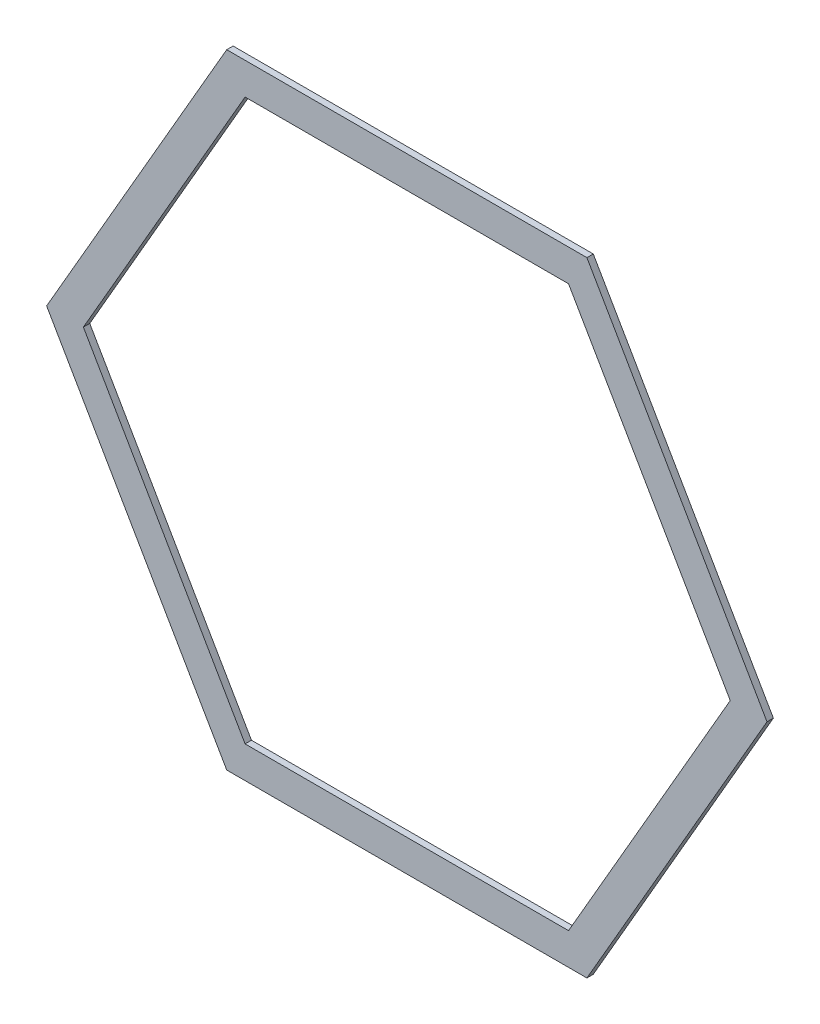
ISO-10303-21;
HEADER;
FILE_DESCRIPTION(('STEP AP214'),'2;1');
FILE_NAME('part.step','',(''),(''),'','','');
FILE_SCHEMA(('AUTOMOTIVE_DESIGN { 1 0 10303 214 1 1 1 1 }'));
ENDSEC;
DATA;
#1=APPLICATION_CONTEXT('core data for automotive mechanical design processes');
#2=APPLICATION_PROTOCOL_DEFINITION('international standard','automotive_design',2000,#1);
#3=PRODUCT_CONTEXT('',#1,'mechanical');
#4=PRODUCT('Part','Part','',(#3));
#5=PRODUCT_RELATED_PRODUCT_CATEGORY('part','',(#4));
#6=PRODUCT_DEFINITION_FORMATION('','',#4);
#7=PRODUCT_DEFINITION_CONTEXT('part definition',#1,'design');
#8=PRODUCT_DEFINITION('design','',#6,#7);
#9=PRODUCT_DEFINITION_SHAPE('','',#8);
#10=(LENGTH_UNIT() NAMED_UNIT(*) SI_UNIT(.MILLI.,.METRE.));
#11=(NAMED_UNIT(*) PLANE_ANGLE_UNIT() SI_UNIT($,.RADIAN.));
#12=(NAMED_UNIT(*) SI_UNIT($,.STERADIAN.) SOLID_ANGLE_UNIT());
#13=UNCERTAINTY_MEASURE_WITH_UNIT(LENGTH_MEASURE(1.E-05),#10,'distance_accuracy_value','');
#14=(GEOMETRIC_REPRESENTATION_CONTEXT(3) GLOBAL_UNCERTAINTY_ASSIGNED_CONTEXT((#13)) GLOBAL_UNIT_ASSIGNED_CONTEXT((#10,
#11,#12)) REPRESENTATION_CONTEXT('',''));
#15=CARTESIAN_POINT('',(0.,0.,0.));
#16=DIRECTION('',(0.,0.,1.));
#17=DIRECTION('',(1.,0.,0.));
#18=AXIS2_PLACEMENT_3D('',#15,#16,#17);
#19=CARTESIAN_POINT('',(0.,0.,1.));
#20=DIRECTION('',(0.,0.,1.));
#21=DIRECTION('',(1.,0.,0.));
#22=AXIS2_PLACEMENT_3D('',#19,#20,#21);
#23=PLANE('',#22);
#24=DIRECTION('',(0.5,0.866025403784439,0.));
#25=VECTOR('',#24,1.);
#26=CARTESIAN_POINT('',(28.2901631902917,-49.,1.));
#27=LINE('',#26,#25);
#28=CARTESIAN_POINT('',(28.2901631902917,-49.,1.));
#29=VERTEX_POINT('',#28);
#30=CARTESIAN_POINT('',(56.5803263805833,0.,1.));
#31=VERTEX_POINT('',#30);
#32=EDGE_CURVE('E173',#29,#31,#27,.T.);
#33=ORIENTED_EDGE('',*,*,#32,.T.);
#34=DIRECTION('',(-0.5,0.866025403784438,0.));
#35=VECTOR('',#34,1.);
#36=CARTESIAN_POINT('',(56.5803263805833,0.,1.));
#37=LINE('',#36,#35);
#38=CARTESIAN_POINT('',(28.2901631902917,49.,1.));
#39=VERTEX_POINT('',#38);
#40=EDGE_CURVE('E176',#31,#39,#37,.T.);
#41=ORIENTED_EDGE('',*,*,#40,.T.);
#42=DIRECTION('',(-1.,0.,0.));
#43=VECTOR('',#42,1.);
#44=CARTESIAN_POINT('',(28.2901631902917,49.,1.));
#45=LINE('',#44,#43);
#46=CARTESIAN_POINT('',(-28.2901631902917,49.,1.));
#47=VERTEX_POINT('',#46);
#48=EDGE_CURVE('E179',#39,#47,#45,.T.);
#49=ORIENTED_EDGE('',*,*,#48,.T.);
#50=DIRECTION('',(-0.5,-0.866025403784439,0.));
#51=VECTOR('',#50,1.);
#52=CARTESIAN_POINT('',(-28.2901631902917,49.,1.));
#53=LINE('',#52,#51);
#54=CARTESIAN_POINT('',(-56.5803263805833,0.,1.));
#55=VERTEX_POINT('',#54);
#56=EDGE_CURVE('E181',#47,#55,#53,.T.);
#57=ORIENTED_EDGE('',*,*,#56,.T.);
#58=DIRECTION('',(0.5,-0.866025403784438,0.));
#59=VECTOR('',#58,1.);
#60=CARTESIAN_POINT('',(-56.5803263805833,0.,1.));
#61=LINE('',#60,#59);
#62=CARTESIAN_POINT('',(-28.2901631902917,-49.,1.));
#63=VERTEX_POINT('',#62);
#64=EDGE_CURVE('E183',#55,#63,#61,.T.);
#65=ORIENTED_EDGE('',*,*,#64,.T.);
#66=DIRECTION('',(1.,0.,0.));
#67=VECTOR('',#66,1.);
#68=CARTESIAN_POINT('',(-28.2901631902917,-49.,1.));
#69=LINE('',#68,#67);
#70=EDGE_CURVE('E185',#63,#29,#69,.T.);
#71=ORIENTED_EDGE('',*,*,#70,.T.);
#72=EDGE_LOOP('',(#33,#41,#49,#57,#65,#71));
#73=FACE_BOUND('',#72,.T.);
#74=DIRECTION('',(-0.5,0.866025403784439,0.));
#75=VECTOR('',#74,1.);
#76=CARTESIAN_POINT('',(50.8068236886871,0.,1.));
#77=LINE('',#76,#75);
#78=CARTESIAN_POINT('',(50.8068236886871,0.,1.));
#79=VERTEX_POINT('',#78);
#80=CARTESIAN_POINT('',(25.4034118443436,44.,1.));
#81=VERTEX_POINT('',#80);
#82=EDGE_CURVE('E130',#79,#81,#77,.T.);
#83=ORIENTED_EDGE('',*,*,#82,.F.);
#84=DIRECTION('',(0.499999999999999,0.866025403784439,0.));
#85=VECTOR('',#84,1.);
#86=CARTESIAN_POINT('',(25.4034118443436,-44.0000000000001,1.));
#87=LINE('',#86,#85);
#88=CARTESIAN_POINT('',(25.4034118443436,-44.0000000000001,1.));
#89=VERTEX_POINT('',#88);
#90=EDGE_CURVE('E122',#89,#79,#87,.T.);
#91=ORIENTED_EDGE('',*,*,#90,.F.);
#92=DIRECTION('',(1.,0.,0.));
#93=VECTOR('',#92,1.);
#94=CARTESIAN_POINT('',(-25.4034118443435,-44.,1.));
#95=LINE('',#94,#93);
#96=CARTESIAN_POINT('',(-25.4034118443435,-44.,1.));
#97=VERTEX_POINT('',#96);
#98=EDGE_CURVE('E151',#97,#89,#95,.T.);
#99=ORIENTED_EDGE('',*,*,#98,.F.);
#100=DIRECTION('',(0.5,-0.866025403784439,0.));
#101=VECTOR('',#100,1.);
#102=CARTESIAN_POINT('',(-50.8068236886871,0.,1.));
#103=LINE('',#102,#101);
#104=CARTESIAN_POINT('',(-50.8068236886871,0.,1.));
#105=VERTEX_POINT('',#104);
#106=EDGE_CURVE('E149',#105,#97,#103,.T.);
#107=ORIENTED_EDGE('',*,*,#106,.F.);
#108=DIRECTION('',(-0.5,-0.866025403784439,0.));
#109=VECTOR('',#108,1.);
#110=CARTESIAN_POINT('',(-25.4034118443436,44.,1.));
#111=LINE('',#110,#109);
#112=CARTESIAN_POINT('',(-25.4034118443436,44.,1.));
#113=VERTEX_POINT('',#112);
#114=EDGE_CURVE('E145',#113,#105,#111,.T.);
#115=ORIENTED_EDGE('',*,*,#114,.F.);
#116=DIRECTION('',(-1.,0.,0.));
#117=VECTOR('',#116,1.);
#118=CARTESIAN_POINT('',(25.4034118443436,44.,1.));
#119=LINE('',#118,#117);
#120=EDGE_CURVE('E143',#81,#113,#119,.T.);
#121=ORIENTED_EDGE('',*,*,#120,.F.);
#122=EDGE_LOOP('',(#83,#91,#99,#107,#115,#121));
#123=FACE_BOUND('',#122,.T.);
#124=ADVANCED_FACE('F33',(#73,#123),#23,.T.);
#125=CARTESIAN_POINT('',(0.,0.,0.));
#126=DIRECTION('',(0.,0.,1.));
#127=DIRECTION('',(1.,0.,0.));
#128=AXIS2_PLACEMENT_3D('',#125,#126,#127);
#129=PLANE('',#128);
#130=DIRECTION('',(0.5,0.866025403784439,0.));
#131=VECTOR('',#130,1.);
#132=CARTESIAN_POINT('',(28.2901631902917,-49.,0.));
#133=LINE('',#132,#131);
#134=CARTESIAN_POINT('',(28.2901631902917,-49.,0.));
#135=VERTEX_POINT('',#134);
#136=CARTESIAN_POINT('',(56.5803263805833,0.,0.));
#137=VERTEX_POINT('',#136);
#138=EDGE_CURVE('E138',#135,#137,#133,.T.);
#139=ORIENTED_EDGE('',*,*,#138,.F.);
#140=DIRECTION('',(1.,0.,0.));
#141=VECTOR('',#140,1.);
#142=CARTESIAN_POINT('',(-28.2901631902917,-49.,0.));
#143=LINE('',#142,#141);
#144=CARTESIAN_POINT('',(-28.2901631902917,-49.,0.));
#145=VERTEX_POINT('',#144);
#146=EDGE_CURVE('E177',#145,#135,#143,.T.);
#147=ORIENTED_EDGE('',*,*,#146,.F.);
#148=DIRECTION('',(0.5,-0.866025403784438,0.));
#149=VECTOR('',#148,1.);
#150=CARTESIAN_POINT('',(-56.5803263805833,0.,0.));
#151=LINE('',#150,#149);
#152=CARTESIAN_POINT('',(-56.5803263805833,0.,0.));
#153=VERTEX_POINT('',#152);
#154=EDGE_CURVE('E196',#153,#145,#151,.T.);
#155=ORIENTED_EDGE('',*,*,#154,.F.);
#156=DIRECTION('',(-0.5,-0.866025403784439,0.));
#157=VECTOR('',#156,1.);
#158=CARTESIAN_POINT('',(-28.2901631902917,49.,0.));
#159=LINE('',#158,#157);
#160=CARTESIAN_POINT('',(-28.2901631902917,49.,0.));
#161=VERTEX_POINT('',#160);
#162=EDGE_CURVE('E194',#161,#153,#159,.T.);
#163=ORIENTED_EDGE('',*,*,#162,.F.);
#164=DIRECTION('',(-1.,0.,0.));
#165=VECTOR('',#164,1.);
#166=CARTESIAN_POINT('',(28.2901631902917,49.,0.));
#167=LINE('',#166,#165);
#168=CARTESIAN_POINT('',(28.2901631902917,49.,0.));
#169=VERTEX_POINT('',#168);
#170=EDGE_CURVE('E192',#169,#161,#167,.T.);
#171=ORIENTED_EDGE('',*,*,#170,.F.);
#172=DIRECTION('',(-0.5,0.866025403784438,0.));
#173=VECTOR('',#172,1.);
#174=CARTESIAN_POINT('',(56.5803263805833,0.,0.));
#175=LINE('',#174,#173);
#176=EDGE_CURVE('E190',#137,#169,#175,.T.);
#177=ORIENTED_EDGE('',*,*,#176,.F.);
#178=EDGE_LOOP('',(#139,#147,#155,#163,#171,#177));
#179=FACE_BOUND('',#178,.T.);
#180=DIRECTION('',(0.499999999999999,0.866025403784439,0.));
#181=VECTOR('',#180,1.);
#182=CARTESIAN_POINT('',(25.4034118443436,-44.0000000000001,0.));
#183=LINE('',#182,#181);
#184=CARTESIAN_POINT('',(25.4034118443436,-44.0000000000001,0.));
#185=VERTEX_POINT('',#184);
#186=CARTESIAN_POINT('',(50.8068236886871,0.,0.));
#187=VERTEX_POINT('',#186);
#188=EDGE_CURVE('E56',#185,#187,#183,.T.);
#189=ORIENTED_EDGE('',*,*,#188,.T.);
#190=DIRECTION('',(-0.5,0.866025403784439,0.));
#191=VECTOR('',#190,1.);
#192=CARTESIAN_POINT('',(50.8068236886871,0.,0.));
#193=LINE('',#192,#191);
#194=CARTESIAN_POINT('',(25.4034118443436,44.,0.));
#195=VERTEX_POINT('',#194);
#196=EDGE_CURVE('E137',#187,#195,#193,.T.);
#197=ORIENTED_EDGE('',*,*,#196,.T.);
#198=DIRECTION('',(-1.,0.,0.));
#199=VECTOR('',#198,1.);
#200=CARTESIAN_POINT('',(25.4034118443436,44.,0.));
#201=LINE('',#200,#199);
#202=CARTESIAN_POINT('',(-25.4034118443436,44.,0.));
#203=VERTEX_POINT('',#202);
#204=EDGE_CURVE('E155',#195,#203,#201,.T.);
#205=ORIENTED_EDGE('',*,*,#204,.T.);
#206=DIRECTION('',(-0.5,-0.866025403784439,0.));
#207=VECTOR('',#206,1.);
#208=CARTESIAN_POINT('',(-25.4034118443436,44.,0.));
#209=LINE('',#208,#207);
#210=CARTESIAN_POINT('',(-50.8068236886871,0.,0.));
#211=VERTEX_POINT('',#210);
#212=EDGE_CURVE('E158',#203,#211,#209,.T.);
#213=ORIENTED_EDGE('',*,*,#212,.T.);
#214=DIRECTION('',(0.5,-0.866025403784439,0.));
#215=VECTOR('',#214,1.);
#216=CARTESIAN_POINT('',(-50.8068236886871,0.,0.));
#217=LINE('',#216,#215);
#218=CARTESIAN_POINT('',(-25.4034118443435,-44.,0.));
#219=VERTEX_POINT('',#218);
#220=EDGE_CURVE('E161',#211,#219,#217,.T.);
#221=ORIENTED_EDGE('',*,*,#220,.T.);
#222=DIRECTION('',(1.,0.,0.));
#223=VECTOR('',#222,1.);
#224=CARTESIAN_POINT('',(-25.4034118443435,-44.,0.));
#225=LINE('',#224,#223);
#226=EDGE_CURVE('E131',#219,#185,#225,.T.);
#227=ORIENTED_EDGE('',*,*,#226,.T.);
#228=EDGE_LOOP('',(#189,#197,#205,#213,#221,#227));
#229=FACE_BOUND('',#228,.T.);
#230=ADVANCED_FACE('F220',(#179,#229),#129,.F.);
#231=CARTESIAN_POINT('',(28.2901631902917,-49.,1.));
#232=DIRECTION('',(-0.866025403784439,0.5,0.));
#233=DIRECTION('',(-0.5,-0.866025403784439,0.));
#234=AXIS2_PLACEMENT_3D('',#231,#232,#233);
#235=PLANE('',#234);
#236=ORIENTED_EDGE('',*,*,#138,.T.);
#237=DIRECTION('',(0.,0.,-1.));
#238=VECTOR('',#237,1.);
#239=CARTESIAN_POINT('',(56.5803263805833,0.,1.));
#240=LINE('',#239,#238);
#241=EDGE_CURVE('E11',#31,#137,#240,.T.);
#242=ORIENTED_EDGE('',*,*,#241,.F.);
#243=ORIENTED_EDGE('',*,*,#32,.F.);
#244=DIRECTION('',(0.,0.,-1.));
#245=VECTOR('',#244,1.);
#246=CARTESIAN_POINT('',(28.2901631902917,-49.,1.));
#247=LINE('',#246,#245);
#248=EDGE_CURVE('E187',#29,#135,#247,.T.);
#249=ORIENTED_EDGE('',*,*,#248,.T.);
#250=EDGE_LOOP('',(#236,#242,#243,#249));
#251=FACE_BOUND('',#250,.T.);
#252=ADVANCED_FACE('F35',(#251),#235,.F.);
#253=CARTESIAN_POINT('',(56.5803263805833,0.,1.));
#254=DIRECTION('',(-0.866025403784438,-0.5,0.));
#255=DIRECTION('',(0.5,-0.866025403784439,0.));
#256=AXIS2_PLACEMENT_3D('',#253,#254,#255);
#257=PLANE('',#256);
#258=ORIENTED_EDGE('',*,*,#176,.T.);
#259=DIRECTION('',(0.,0.,-1.));
#260=VECTOR('',#259,1.);
#261=CARTESIAN_POINT('',(28.2901631902917,49.,1.));
#262=LINE('',#261,#260);
#263=EDGE_CURVE('E41',#39,#169,#262,.T.);
#264=ORIENTED_EDGE('',*,*,#263,.F.);
#265=ORIENTED_EDGE('',*,*,#40,.F.);
#266=ORIENTED_EDGE('',*,*,#241,.T.);
#267=EDGE_LOOP('',(#258,#264,#265,#266));
#268=FACE_BOUND('',#267,.T.);
#269=ADVANCED_FACE('F237',(#268),#257,.F.);
#270=CARTESIAN_POINT('',(28.2901631902917,49.,1.));
#271=DIRECTION('',(0.,-1.,0.));
#272=DIRECTION('',(0.,0.,-1.));
#273=AXIS2_PLACEMENT_3D('',#270,#271,#272);
#274=PLANE('',#273);
#275=ORIENTED_EDGE('',*,*,#170,.T.);
#276=DIRECTION('',(0.,0.,-1.));
#277=VECTOR('',#276,1.);
#278=CARTESIAN_POINT('',(-28.2901631902917,49.,1.));
#279=LINE('',#278,#277);
#280=EDGE_CURVE('E207',#47,#161,#279,.T.);
#281=ORIENTED_EDGE('',*,*,#280,.F.);
#282=ORIENTED_EDGE('',*,*,#48,.F.);
#283=ORIENTED_EDGE('',*,*,#263,.T.);
#284=EDGE_LOOP('',(#275,#281,#282,#283));
#285=FACE_BOUND('',#284,.T.);
#286=ADVANCED_FACE('F214',(#285),#274,.F.);
#287=CARTESIAN_POINT('',(-28.2901631902917,49.,1.));
#288=DIRECTION('',(0.866025403784439,-0.5,0.));
#289=DIRECTION('',(0.5,0.866025403784439,0.));
#290=AXIS2_PLACEMENT_3D('',#287,#288,#289);
#291=PLANE('',#290);
#292=ORIENTED_EDGE('',*,*,#162,.T.);
#293=DIRECTION('',(0.,0.,-1.));
#294=VECTOR('',#293,1.);
#295=CARTESIAN_POINT('',(-56.5803263805833,0.,1.));
#296=LINE('',#295,#294);
#297=EDGE_CURVE('E204',#55,#153,#296,.T.);
#298=ORIENTED_EDGE('',*,*,#297,.F.);
#299=ORIENTED_EDGE('',*,*,#56,.F.);
#300=ORIENTED_EDGE('',*,*,#280,.T.);
#301=EDGE_LOOP('',(#292,#298,#299,#300));
#302=FACE_BOUND('',#301,.T.);
#303=ADVANCED_FACE('F226',(#302),#291,.F.);
#304=CARTESIAN_POINT('',(-56.5803263805833,0.,1.));
#305=DIRECTION('',(0.866025403784439,0.5,0.));
#306=DIRECTION('',(-0.5,0.866025403784438,0.));
#307=AXIS2_PLACEMENT_3D('',#304,#305,#306);
#308=PLANE('',#307);
#309=ORIENTED_EDGE('',*,*,#154,.T.);
#310=DIRECTION('',(0.,0.,-1.));
#311=VECTOR('',#310,1.);
#312=CARTESIAN_POINT('',(-28.2901631902917,-49.,1.));
#313=LINE('',#312,#311);
#314=EDGE_CURVE('E201',#63,#145,#313,.T.);
#315=ORIENTED_EDGE('',*,*,#314,.F.);
#316=ORIENTED_EDGE('',*,*,#64,.F.);
#317=ORIENTED_EDGE('',*,*,#297,.T.);
#318=EDGE_LOOP('',(#309,#315,#316,#317));
#319=FACE_BOUND('',#318,.T.);
#320=ADVANCED_FACE('F230',(#319),#308,.F.);
#321=CARTESIAN_POINT('',(-28.2901631902917,-49.,1.));
#322=DIRECTION('',(0.,1.,0.));
#323=DIRECTION('',(-1.,0.,0.));
#324=AXIS2_PLACEMENT_3D('',#321,#322,#323);
#325=PLANE('',#324);
#326=ORIENTED_EDGE('',*,*,#146,.T.);
#327=ORIENTED_EDGE('',*,*,#248,.F.);
#328=ORIENTED_EDGE('',*,*,#70,.F.);
#329=ORIENTED_EDGE('',*,*,#314,.T.);
#330=EDGE_LOOP('',(#326,#327,#328,#329));
#331=FACE_BOUND('',#330,.T.);
#332=ADVANCED_FACE('F240',(#331),#325,.F.);
#333=CARTESIAN_POINT('',(25.4034118443436,-44.0000000000001,1.));
#334=DIRECTION('',(-0.866025403784439,0.5,0.));
#335=DIRECTION('',(-0.499999999999999,-0.866025403784439,0.));
#336=AXIS2_PLACEMENT_3D('',#333,#334,#335);
#337=PLANE('',#336);
#338=ORIENTED_EDGE('',*,*,#188,.F.);
#339=DIRECTION('',(0.,0.,-1.));
#340=VECTOR('',#339,1.);
#341=CARTESIAN_POINT('',(25.4034118443436,-44.0000000000001,1.));
#342=LINE('',#341,#340);
#343=EDGE_CURVE('E126',#89,#185,#342,.T.);
#344=ORIENTED_EDGE('',*,*,#343,.F.);
#345=ORIENTED_EDGE('',*,*,#90,.T.);
#346=DIRECTION('',(0.,0.,-1.));
#347=VECTOR('',#346,1.);
#348=CARTESIAN_POINT('',(50.8068236886871,0.,1.));
#349=LINE('',#348,#347);
#350=EDGE_CURVE('E125',#79,#187,#349,.T.);
#351=ORIENTED_EDGE('',*,*,#350,.T.);
#352=EDGE_LOOP('',(#338,#344,#345,#351));
#353=FACE_BOUND('',#352,.T.);
#354=ADVANCED_FACE('F124',(#353),#337,.T.);
#355=CARTESIAN_POINT('',(50.8068236886871,0.,1.));
#356=DIRECTION('',(-0.866025403784439,-0.5,0.));
#357=DIRECTION('',(0.5,-0.866025403784439,0.));
#358=AXIS2_PLACEMENT_3D('',#355,#356,#357);
#359=PLANE('',#358);
#360=ORIENTED_EDGE('',*,*,#196,.F.);
#361=ORIENTED_EDGE('',*,*,#350,.F.);
#362=ORIENTED_EDGE('',*,*,#82,.T.);
#363=DIRECTION('',(0.,0.,-1.));
#364=VECTOR('',#363,1.);
#365=CARTESIAN_POINT('',(25.4034118443436,44.,1.));
#366=LINE('',#365,#364);
#367=EDGE_CURVE('E139',#81,#195,#366,.T.);
#368=ORIENTED_EDGE('',*,*,#367,.T.);
#369=EDGE_LOOP('',(#360,#361,#362,#368));
#370=FACE_BOUND('',#369,.T.);
#371=ADVANCED_FACE('F134',(#370),#359,.T.);
#372=CARTESIAN_POINT('',(25.4034118443436,44.,1.));
#373=DIRECTION('',(0.,-1.,0.));
#374=DIRECTION('',(0.,0.,-1.));
#375=AXIS2_PLACEMENT_3D('',#372,#373,#374);
#376=PLANE('',#375);
#377=ORIENTED_EDGE('',*,*,#204,.F.);
#378=ORIENTED_EDGE('',*,*,#367,.F.);
#379=ORIENTED_EDGE('',*,*,#120,.T.);
#380=DIRECTION('',(0.,0.,-1.));
#381=VECTOR('',#380,1.);
#382=CARTESIAN_POINT('',(-25.4034118443436,44.,1.));
#383=LINE('',#382,#381);
#384=EDGE_CURVE('E170',#113,#203,#383,.T.);
#385=ORIENTED_EDGE('',*,*,#384,.T.);
#386=EDGE_LOOP('',(#377,#378,#379,#385));
#387=FACE_BOUND('',#386,.T.);
#388=ADVANCED_FACE('F258',(#387),#376,.T.);
#389=CARTESIAN_POINT('',(-25.4034118443436,44.,1.));
#390=DIRECTION('',(0.866025403784439,-0.5,0.));
#391=DIRECTION('',(0.5,0.866025403784439,0.));
#392=AXIS2_PLACEMENT_3D('',#389,#390,#391);
#393=PLANE('',#392);
#394=ORIENTED_EDGE('',*,*,#212,.F.);
#395=ORIENTED_EDGE('',*,*,#384,.F.);
#396=ORIENTED_EDGE('',*,*,#114,.T.);
#397=DIRECTION('',(0.,0.,-1.));
#398=VECTOR('',#397,1.);
#399=CARTESIAN_POINT('',(-50.8068236886871,0.,1.));
#400=LINE('',#399,#398);
#401=EDGE_CURVE('E168',#105,#211,#400,.T.);
#402=ORIENTED_EDGE('',*,*,#401,.T.);
#403=EDGE_LOOP('',(#394,#395,#396,#402));
#404=FACE_BOUND('',#403,.T.);
#405=ADVANCED_FACE('F261',(#404),#393,.T.);
#406=CARTESIAN_POINT('',(-50.8068236886871,0.,1.));
#407=DIRECTION('',(0.866025403784439,0.5,0.));
#408=DIRECTION('',(-0.5,0.866025403784439,0.));
#409=AXIS2_PLACEMENT_3D('',#406,#407,#408);
#410=PLANE('',#409);
#411=ORIENTED_EDGE('',*,*,#220,.F.);
#412=ORIENTED_EDGE('',*,*,#401,.F.);
#413=ORIENTED_EDGE('',*,*,#106,.T.);
#414=DIRECTION('',(0.,0.,-1.));
#415=VECTOR('',#414,1.);
#416=CARTESIAN_POINT('',(-25.4034118443435,-44.,1.));
#417=LINE('',#416,#415);
#418=EDGE_CURVE('E48',#97,#219,#417,.T.);
#419=ORIENTED_EDGE('',*,*,#418,.T.);
#420=EDGE_LOOP('',(#411,#412,#413,#419));
#421=FACE_BOUND('',#420,.T.);
#422=ADVANCED_FACE('F265',(#421),#410,.T.);
#423=CARTESIAN_POINT('',(-25.4034118443435,-44.,1.));
#424=DIRECTION('',(0.,1.,0.));
#425=DIRECTION('',(-1.,0.,0.));
#426=AXIS2_PLACEMENT_3D('',#423,#424,#425);
#427=PLANE('',#426);
#428=ORIENTED_EDGE('',*,*,#226,.F.);
#429=ORIENTED_EDGE('',*,*,#418,.F.);
#430=ORIENTED_EDGE('',*,*,#98,.T.);
#431=ORIENTED_EDGE('',*,*,#343,.T.);
#432=EDGE_LOOP('',(#428,#429,#430,#431));
#433=FACE_BOUND('',#432,.T.);
#434=ADVANCED_FACE('F269',(#433),#427,.T.);
#435=CLOSED_SHELL('',(#124,#230,#252,#269,#286,#303,#320,#332,#354,#371,#388,#405,#422,#434));
#436=MANIFOLD_SOLID_BREP('B2',#435);
#437=ADVANCED_BREP_SHAPE_REPRESENTATION('',(#18,#436),#14);
#438=SHAPE_DEFINITION_REPRESENTATION(#9,#437);
ENDSEC;
END-ISO-10303-21;
